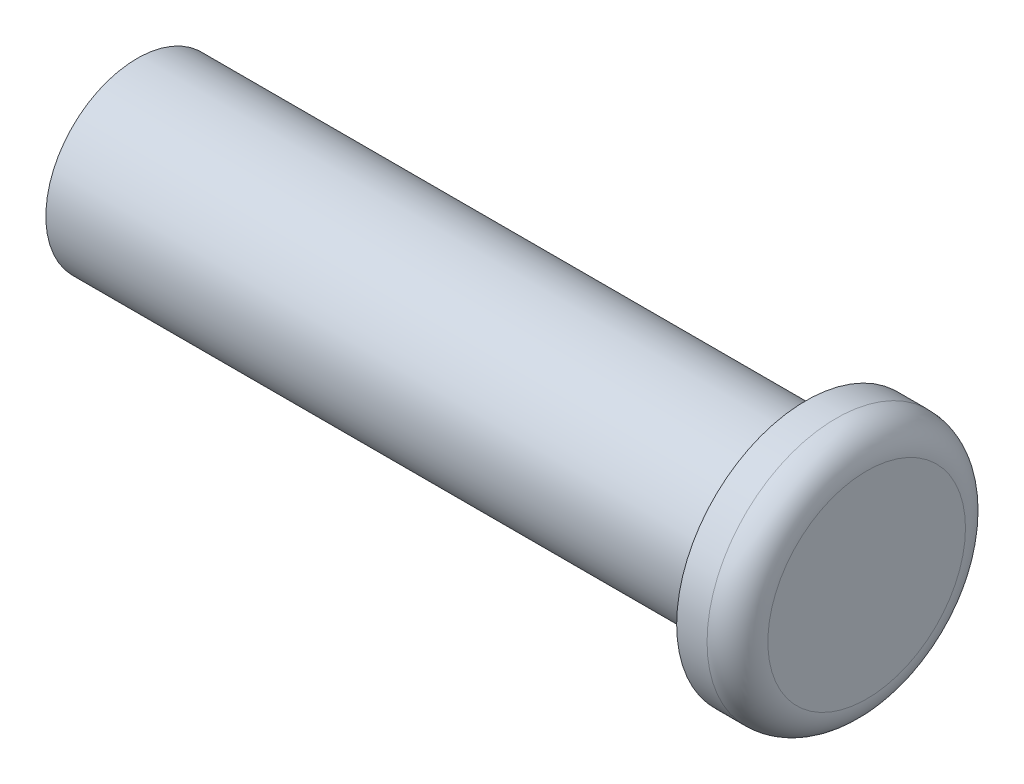
ISO-10303-21;
HEADER;
FILE_DESCRIPTION(('STEP AP214'),'2;1');
FILE_NAME('part.step','',(''),(''),'','','');
FILE_SCHEMA(('AUTOMOTIVE_DESIGN { 1 0 10303 214 1 1 1 1 }'));
ENDSEC;
DATA;
#1=APPLICATION_CONTEXT('core data for automotive mechanical design processes');
#2=APPLICATION_PROTOCOL_DEFINITION('international standard','automotive_design',2000,#1);
#3=PRODUCT_CONTEXT('',#1,'mechanical');
#4=PRODUCT('Part','Part','',(#3));
#5=PRODUCT_RELATED_PRODUCT_CATEGORY('part','',(#4));
#6=PRODUCT_DEFINITION_FORMATION('','',#4);
#7=PRODUCT_DEFINITION_CONTEXT('part definition',#1,'design');
#8=PRODUCT_DEFINITION('design','',#6,#7);
#9=PRODUCT_DEFINITION_SHAPE('','',#8);
#10=(LENGTH_UNIT() NAMED_UNIT(*) SI_UNIT(.MILLI.,.METRE.));
#11=(NAMED_UNIT(*) PLANE_ANGLE_UNIT() SI_UNIT($,.RADIAN.));
#12=(NAMED_UNIT(*) SI_UNIT($,.STERADIAN.) SOLID_ANGLE_UNIT());
#13=UNCERTAINTY_MEASURE_WITH_UNIT(LENGTH_MEASURE(1.E-05),#10,'distance_accuracy_value','');
#14=(GEOMETRIC_REPRESENTATION_CONTEXT(3) GLOBAL_UNCERTAINTY_ASSIGNED_CONTEXT((#13)) GLOBAL_UNIT_ASSIGNED_CONTEXT((#10,
#11,#12)) REPRESENTATION_CONTEXT('',''));
#15=CARTESIAN_POINT('',(0.,0.,0.));
#16=DIRECTION('',(0.,0.,1.));
#17=DIRECTION('',(1.,0.,0.));
#18=AXIS2_PLACEMENT_3D('',#15,#16,#17);
#19=CARTESIAN_POINT('',(11.,0.,0.));
#20=DIRECTION('',(-1.,0.,0.));
#21=DIRECTION('',(0.,0.,1.));
#22=AXIS2_PLACEMENT_3D('',#19,#20,#21);
#23=CYLINDRICAL_SURFACE('',#22,3.);
#24=CARTESIAN_POINT('',(11.,0.,0.));
#25=DIRECTION('',(1.,0.,0.));
#26=DIRECTION('',(0.,0.,-1.));
#27=AXIS2_PLACEMENT_3D('',#24,#25,#26);
#28=CIRCLE('',#27,3.);
#29=CARTESIAN_POINT('',(11.,0.,-3.));
#30=VERTEX_POINT('',#29);
#31=EDGE_CURVE('E42',#30,#30,#28,.T.);
#32=ORIENTED_EDGE('',*,*,#31,.F.);
#33=EDGE_LOOP('',(#32));
#34=FACE_BOUND('',#33,.T.);
#35=CARTESIAN_POINT('',(-11.,0.,0.));
#36=DIRECTION('',(1.,0.,0.));
#37=DIRECTION('',(0.,0.,-1.));
#38=AXIS2_PLACEMENT_3D('',#35,#36,#37);
#39=CIRCLE('',#38,3.);
#40=CARTESIAN_POINT('',(-11.,0.,-3.));
#41=VERTEX_POINT('',#40);
#42=EDGE_CURVE('E46',#41,#41,#39,.T.);
#43=ORIENTED_EDGE('',*,*,#42,.T.);
#44=EDGE_LOOP('',(#43));
#45=FACE_BOUND('',#44,.T.);
#46=ADVANCED_FACE('F31',(#34,#45),#23,.T.);
#47=CARTESIAN_POINT('',(-11.,0.,0.));
#48=DIRECTION('',(1.,0.,0.));
#49=DIRECTION('',(0.,0.,-1.));
#50=AXIS2_PLACEMENT_3D('',#47,#48,#49);
#51=PLANE('',#50);
#52=ORIENTED_EDGE('',*,*,#42,.F.);
#53=EDGE_LOOP('',(#52));
#54=FACE_BOUND('',#53,.T.);
#55=ADVANCED_FACE('F70',(#54),#51,.F.);
#56=CARTESIAN_POINT('',(13.,0.,0.));
#57=DIRECTION('',(-1.,0.,0.));
#58=DIRECTION('',(0.,0.,1.));
#59=AXIS2_PLACEMENT_3D('',#56,#57,#58);
#60=CYLINDRICAL_SURFACE('',#59,4.25);
#61=CARTESIAN_POINT('',(12.,0.,0.));
#62=DIRECTION('',(1.,0.,0.));
#63=DIRECTION('',(0.,0.,-1.));
#64=AXIS2_PLACEMENT_3D('',#61,#62,#63);
#65=CIRCLE('',#64,4.25);
#66=CARTESIAN_POINT('',(12.,0.,-4.25));
#67=VERTEX_POINT('',#66);
#68=EDGE_CURVE('E10',#67,#67,#65,.F.);
#69=ORIENTED_EDGE('',*,*,#68,.T.);
#70=EDGE_LOOP('',(#69));
#71=FACE_BOUND('',#70,.T.);
#72=CARTESIAN_POINT('',(11.,0.,0.));
#73=DIRECTION('',(1.,0.,0.));
#74=DIRECTION('',(0.,0.,-1.));
#75=AXIS2_PLACEMENT_3D('',#72,#73,#74);
#76=CIRCLE('',#75,4.25);
#77=CARTESIAN_POINT('',(11.,0.,-4.25));
#78=VERTEX_POINT('',#77);
#79=EDGE_CURVE('E50',#78,#78,#76,.T.);
#80=ORIENTED_EDGE('',*,*,#79,.T.);
#81=EDGE_LOOP('',(#80));
#82=FACE_BOUND('',#81,.T.);
#83=ADVANCED_FACE('F55',(#71,#82),#60,.T.);
#84=CARTESIAN_POINT('',(13.,0.,0.));
#85=DIRECTION('',(1.,0.,0.));
#86=DIRECTION('',(0.,0.,-1.));
#87=AXIS2_PLACEMENT_3D('',#84,#85,#86);
#88=PLANE('',#87);
#89=CARTESIAN_POINT('',(13.,0.,0.));
#90=DIRECTION('',(1.,0.,0.));
#91=DIRECTION('',(0.,0.,-1.));
#92=AXIS2_PLACEMENT_3D('',#89,#90,#91);
#93=CIRCLE('',#92,3.25);
#94=CARTESIAN_POINT('',(13.,0.,-3.25));
#95=VERTEX_POINT('',#94);
#96=EDGE_CURVE('E38',#95,#95,#93,.T.);
#97=ORIENTED_EDGE('',*,*,#96,.T.);
#98=EDGE_LOOP('',(#97));
#99=FACE_BOUND('',#98,.T.);
#100=ADVANCED_FACE('F59',(#99),#88,.T.);
#101=CARTESIAN_POINT('',(11.,0.,0.));
#102=DIRECTION('',(1.,0.,0.));
#103=DIRECTION('',(0.,0.,-1.));
#104=AXIS2_PLACEMENT_3D('',#101,#102,#103);
#105=PLANE('',#104);
#106=ORIENTED_EDGE('',*,*,#31,.T.);
#107=EDGE_LOOP('',(#106));
#108=FACE_BOUND('',#107,.T.);
#109=ORIENTED_EDGE('',*,*,#79,.F.);
#110=EDGE_LOOP('',(#109));
#111=FACE_BOUND('',#110,.T.);
#112=ADVANCED_FACE('F57',(#108,#111),#105,.F.);
#113=CARTESIAN_POINT('',(12.,0.,0.));
#114=DIRECTION('',(1.,0.,0.));
#115=DIRECTION('',(0.,0.,-1.));
#116=AXIS2_PLACEMENT_3D('',#113,#114,#115);
#117=TOROIDAL_SURFACE('',#116,3.25,1.);
#118=ORIENTED_EDGE('',*,*,#68,.F.);
#119=EDGE_LOOP('',(#118));
#120=FACE_BOUND('',#119,.T.);
#121=ORIENTED_EDGE('',*,*,#96,.F.);
#122=EDGE_LOOP('',(#121));
#123=FACE_BOUND('',#122,.T.);
#124=ADVANCED_FACE('F33',(#120,#123),#117,.T.);
#125=CLOSED_SHELL('',(#46,#55,#83,#100,#112,#124));
#126=MANIFOLD_SOLID_BREP('B2',#125);
#127=ADVANCED_BREP_SHAPE_REPRESENTATION('',(#18,#126),#14);
#128=SHAPE_DEFINITION_REPRESENTATION(#9,#127);
ENDSEC;
END-ISO-10303-21;
